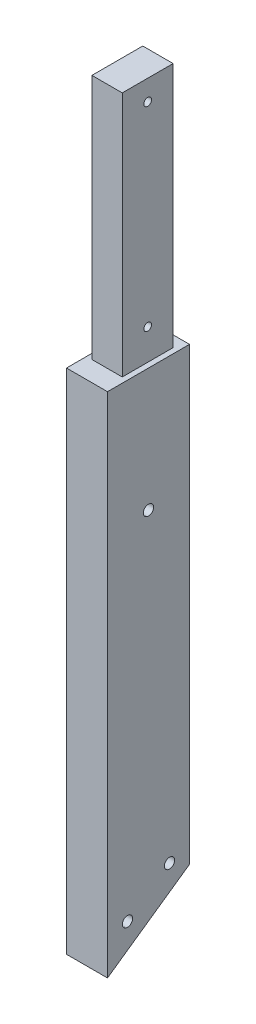
ISO-10303-21;
HEADER;
FILE_DESCRIPTION(('STEP AP214'),'2;1');
FILE_NAME('part.step','',(''),(''),'','','');
FILE_SCHEMA(('AUTOMOTIVE_DESIGN { 1 0 10303 214 1 1 1 1 }'));
ENDSEC;
DATA;
#1=APPLICATION_CONTEXT('core data for automotive mechanical design processes');
#2=APPLICATION_PROTOCOL_DEFINITION('international standard','automotive_design',2000,#1);
#3=PRODUCT_CONTEXT('',#1,'mechanical');
#4=PRODUCT('Part','Part','',(#3));
#5=PRODUCT_RELATED_PRODUCT_CATEGORY('part','',(#4));
#6=PRODUCT_DEFINITION_FORMATION('','',#4);
#7=PRODUCT_DEFINITION_CONTEXT('part definition',#1,'design');
#8=PRODUCT_DEFINITION('design','',#6,#7);
#9=PRODUCT_DEFINITION_SHAPE('','',#8);
#10=(LENGTH_UNIT() NAMED_UNIT(*) SI_UNIT(.MILLI.,.METRE.));
#11=(NAMED_UNIT(*) PLANE_ANGLE_UNIT() SI_UNIT($,.RADIAN.));
#12=(NAMED_UNIT(*) SI_UNIT($,.STERADIAN.) SOLID_ANGLE_UNIT());
#13=UNCERTAINTY_MEASURE_WITH_UNIT(LENGTH_MEASURE(1.E-05),#10,'distance_accuracy_value','');
#14=(GEOMETRIC_REPRESENTATION_CONTEXT(3) GLOBAL_UNCERTAINTY_ASSIGNED_CONTEXT((#13)) GLOBAL_UNIT_ASSIGNED_CONTEXT((#10,
#11,#12)) REPRESENTATION_CONTEXT('',''));
#15=CARTESIAN_POINT('',(0.,0.,0.));
#16=DIRECTION('',(0.,0.,1.));
#17=DIRECTION('',(1.,0.,0.));
#18=AXIS2_PLACEMENT_3D('',#15,#16,#17);
#19=CARTESIAN_POINT('',(0.,176.306244864133,-2.79400000000001));
#20=DIRECTION('',(1.,0.,0.));
#21=DIRECTION('',(0.,1.,0.));
#22=AXIS2_PLACEMENT_3D('',#19,#20,#21);
#23=CYLINDRICAL_SURFACE('',#22,2.38125);
#24=CARTESIAN_POINT('',(3.302,176.306244864133,-2.79400000000001));
#25=DIRECTION('',(1.,0.,0.));
#26=DIRECTION('',(0.,0.,-1.));
#27=AXIS2_PLACEMENT_3D('',#24,#25,#26);
#28=CIRCLE('',#27,2.38125);
#29=CARTESIAN_POINT('',(3.302,178.687494864133,-2.79400000000001));
#30=VERTEX_POINT('',#29);
#31=EDGE_CURVE('E136',#30,#30,#28,.F.);
#32=CARTESIAN_POINT('',(22.098,176.306244864133,-2.79400000000001));
#33=DIRECTION('',(-1.,0.,0.));
#34=DIRECTION('',(0.,0.,1.));
#35=AXIS2_PLACEMENT_3D('',#32,#33,#34);
#36=CIRCLE('',#35,2.38125);
#37=CARTESIAN_POINT('',(22.098,178.687494864133,-2.79400000000001));
#38=VERTEX_POINT('',#37);
#39=EDGE_CURVE('E107',#38,#38,#36,.F.);
#40=CARTESIAN_POINT('',(3.302,178.687494864133,-2.79400000000001));
#41=CARTESIAN_POINT('',(3.49779166666667,178.687494864133,-2.79400000000001));
#42=CARTESIAN_POINT('',(3.69358333333333,178.687494864133,-2.79400000000001));
#43=CARTESIAN_POINT('',(4.08516666666667,178.687494864133,-2.79400000000001));
#44=CARTESIAN_POINT('',(4.28095833333333,178.687494864133,-2.79400000000001));
#45=CARTESIAN_POINT('',(4.67254166666667,178.687494864133,-2.79400000000001));
#46=CARTESIAN_POINT('',(4.86833333333333,178.687494864133,-2.79400000000001));
#47=CARTESIAN_POINT('',(5.25991666666667,178.687494864133,-2.79400000000001));
#48=CARTESIAN_POINT('',(5.45570833333333,178.687494864133,-2.79400000000001));
#49=CARTESIAN_POINT('',(5.84729166666667,178.687494864133,-2.79400000000001));
#50=CARTESIAN_POINT('',(6.04308333333333,178.687494864133,-2.79400000000001));
#51=CARTESIAN_POINT('',(6.43466666666667,178.687494864133,-2.79400000000001));
#52=CARTESIAN_POINT('',(6.63045833333333,178.687494864133,-2.79400000000001));
#53=CARTESIAN_POINT('',(7.02204166666667,178.687494864133,-2.79400000000001));
#54=CARTESIAN_POINT('',(7.21783333333333,178.687494864133,-2.79400000000001));
#55=CARTESIAN_POINT('',(7.60941666666667,178.687494864133,-2.79400000000001));
#56=CARTESIAN_POINT('',(7.80520833333333,178.687494864133,-2.79400000000001));
#57=CARTESIAN_POINT('',(8.19679166666667,178.687494864133,-2.79400000000001));
#58=CARTESIAN_POINT('',(8.39258333333333,178.687494864133,-2.79400000000001));
#59=CARTESIAN_POINT('',(8.78416666666667,178.687494864133,-2.79400000000001));
#60=CARTESIAN_POINT('',(8.97995833333333,178.687494864133,-2.79400000000001));
#61=CARTESIAN_POINT('',(9.37154166666667,178.687494864133,-2.79400000000001));
#62=CARTESIAN_POINT('',(9.56733333333333,178.687494864133,-2.79400000000001));
#63=CARTESIAN_POINT('',(9.95891666666667,178.687494864133,-2.79400000000001));
#64=CARTESIAN_POINT('',(10.1547083333333,178.687494864133,-2.79400000000001));
#65=CARTESIAN_POINT('',(10.5462916666667,178.687494864133,-2.79400000000001));
#66=CARTESIAN_POINT('',(10.7420833333333,178.687494864133,-2.79400000000001));
#67=CARTESIAN_POINT('',(11.1336666666667,178.687494864133,-2.79400000000001));
#68=CARTESIAN_POINT('',(11.3294583333333,178.687494864133,-2.79400000000001));
#69=CARTESIAN_POINT('',(11.7210416666667,178.687494864133,-2.79400000000001));
#70=CARTESIAN_POINT('',(11.9168333333333,178.687494864133,-2.79400000000001));
#71=CARTESIAN_POINT('',(12.3084166666667,178.687494864133,-2.79400000000001));
#72=CARTESIAN_POINT('',(12.5042083333333,178.687494864133,-2.79400000000001));
#73=CARTESIAN_POINT('',(12.8957916666667,178.687494864133,-2.79400000000001));
#74=CARTESIAN_POINT('',(13.0915833333333,178.687494864133,-2.79400000000001));
#75=CARTESIAN_POINT('',(13.4831666666667,178.687494864133,-2.79400000000001));
#76=CARTESIAN_POINT('',(13.6789583333333,178.687494864133,-2.79400000000001));
#77=CARTESIAN_POINT('',(14.0705416666667,178.687494864133,-2.79400000000001));
#78=CARTESIAN_POINT('',(14.2663333333333,178.687494864133,-2.79400000000001));
#79=CARTESIAN_POINT('',(14.6579166666667,178.687494864133,-2.79400000000001));
#80=CARTESIAN_POINT('',(14.8537083333333,178.687494864133,-2.79400000000001));
#81=CARTESIAN_POINT('',(15.2452916666667,178.687494864133,-2.79400000000001));
#82=CARTESIAN_POINT('',(15.4410833333333,178.687494864133,-2.79400000000001));
#83=CARTESIAN_POINT('',(15.8326666666667,178.687494864133,-2.79400000000001));
#84=CARTESIAN_POINT('',(16.0284583333333,178.687494864133,-2.79400000000001));
#85=CARTESIAN_POINT('',(16.4200416666667,178.687494864133,-2.79400000000001));
#86=CARTESIAN_POINT('',(16.6158333333333,178.687494864133,-2.79400000000001));
#87=CARTESIAN_POINT('',(17.0074166666667,178.687494864133,-2.79400000000001));
#88=CARTESIAN_POINT('',(17.2032083333333,178.687494864133,-2.79400000000001));
#89=CARTESIAN_POINT('',(17.5947916666667,178.687494864133,-2.79400000000001));
#90=CARTESIAN_POINT('',(17.7905833333333,178.687494864133,-2.79400000000001));
#91=CARTESIAN_POINT('',(18.1821666666667,178.687494864133,-2.79400000000001));
#92=CARTESIAN_POINT('',(18.3779583333333,178.687494864133,-2.79400000000001));
#93=CARTESIAN_POINT('',(18.7695416666667,178.687494864133,-2.79400000000001));
#94=CARTESIAN_POINT('',(18.9653333333333,178.687494864133,-2.79400000000001));
#95=CARTESIAN_POINT('',(19.3569166666667,178.687494864133,-2.79400000000001));
#96=CARTESIAN_POINT('',(19.5527083333333,178.687494864133,-2.79400000000001));
#97=CARTESIAN_POINT('',(19.9442916666667,178.687494864133,-2.79400000000001));
#98=CARTESIAN_POINT('',(20.1400833333333,178.687494864133,-2.79400000000001));
#99=CARTESIAN_POINT('',(20.5316666666667,178.687494864133,-2.79400000000001));
#100=CARTESIAN_POINT('',(20.7274583333333,178.687494864133,-2.79400000000001));
#101=CARTESIAN_POINT('',(21.1190416666667,178.687494864133,-2.79400000000001));
#102=CARTESIAN_POINT('',(21.3148333333333,178.687494864133,-2.79400000000001));
#103=CARTESIAN_POINT('',(21.7064166666667,178.687494864133,-2.79400000000001));
#104=CARTESIAN_POINT('',(21.9022083333333,178.687494864133,-2.79400000000001));
#105=CARTESIAN_POINT('',(22.098,178.687494864133,-2.79400000000001));
#106=B_SPLINE_CURVE_WITH_KNOTS('',3,(#40,#41,#42,#43,#44,#45,#46,#47,#48,#49,#50,#51,#52,#53,
#54,#55,#56,#57,#58,#59,#60,#61,#62,#63,#64,#65,#66,#67,#68,#69,#70,#71,#72,#73,#74,#75,#76,#77,
#78,#79,#80,#81,#82,#83,#84,#85,#86,#87,#88,#89,#90,#91,#92,#93,#94,#95,#96,#97,#98,#99,#100,
#101,#102,#103,#104,#105),.UNSPECIFIED.,.F.,.F.,(4,2,2,2,2,2,2,2,2,2,2,2,2,2,2,2,2,2,2,2,2,2,2,
2,2,2,2,2,2,2,2,2,4),(0.,0.587375,1.17475,1.762125,2.3495,2.936875,3.52425,4.111625,4.699,
5.286375,5.87375,6.461125,7.0485,7.635875,8.22325,8.810625,9.398,9.985375,10.57275,11.160125,
11.7475,12.334875,12.92225,13.509625,14.097,14.684375,15.27175,15.859125,16.4465,17.033875,
17.62125,18.208625,18.796),.UNSPECIFIED.);
#107=EDGE_CURVE('BSEAM32',#30,#38,#106,.T.);
#108=ORIENTED_EDGE('',*,*,#31,.T.);
#109=ORIENTED_EDGE('',*,*,#39,.T.);
#110=ORIENTED_EDGE('',*,*,#107,.T.);
#111=ORIENTED_EDGE('',*,*,#107,.F.);
#112=EDGE_LOOP('',(#108,#110,#109,#111));
#113=FACE_BOUND('',#112,.T.);
#114=ADVANCED_FACE('F32',(#113),#23,.F.);
#115=CARTESIAN_POINT('',(3.302,309.644961162,0.));
#116=DIRECTION('',(1.,0.,0.));
#117=DIRECTION('',(0.,0.,-1.));
#118=AXIS2_PLACEMENT_3D('',#115,#116,#117);
#119=PLANE('',#118);
#120=DIRECTION('',(0.,0.,-1.));
#121=VECTOR('',#120,1.);
#122=CARTESIAN_POINT('',(3.302,309.644949162,0.));
#123=LINE('',#122,#121);
#124=CARTESIAN_POINT('',(3.302,309.644949162,12.954));
#125=VERTEX_POINT('',#124);
#126=CARTESIAN_POINT('',(3.302,309.644949162,-18.542));
#127=VERTEX_POINT('',#126);
#128=EDGE_CURVE('E140',#125,#127,#123,.T.);
#129=ORIENTED_EDGE('',*,*,#128,.T.);
#130=DIRECTION('',(0.,-1.,0.));
#131=VECTOR('',#130,1.);
#132=CARTESIAN_POINT('',(3.302,309.644961162,-18.542));
#133=LINE('',#132,#131);
#134=CARTESIAN_POINT('',(3.302,157.244949162,-18.542));
#135=VERTEX_POINT('',#134);
#136=EDGE_CURVE('E108',#127,#135,#133,.T.);
#137=ORIENTED_EDGE('',*,*,#136,.T.);
#138=DIRECTION('',(0.,0.,1.));
#139=VECTOR('',#138,1.);
#140=CARTESIAN_POINT('',(3.302,157.244949162,0.));
#141=LINE('',#140,#139);
#142=CARTESIAN_POINT('',(3.302,157.244949162,12.954));
#143=VERTEX_POINT('',#142);
#144=EDGE_CURVE('E111',#135,#143,#141,.T.);
#145=ORIENTED_EDGE('',*,*,#144,.T.);
#146=DIRECTION('',(0.,-1.,0.));
#147=VECTOR('',#146,1.);
#148=CARTESIAN_POINT('',(3.302,309.644961162,12.954));
#149=LINE('',#148,#147);
#150=EDGE_CURVE('E98',#125,#143,#149,.T.);
#151=ORIENTED_EDGE('',*,*,#150,.F.);
#152=EDGE_LOOP('',(#129,#137,#145,#151));
#153=FACE_BOUND('',#152,.T.);
#154=ORIENTED_EDGE('',*,*,#31,.F.);
#155=EDGE_LOOP('',(#154));
#156=FACE_BOUND('',#155,.T.);
#157=CARTESIAN_POINT('',(3.302,296.956244864133,-2.794));
#158=DIRECTION('',(1.,0.,0.));
#159=DIRECTION('',(0.,0.,-1.));
#160=AXIS2_PLACEMENT_3D('',#157,#158,#159);
#161=CIRCLE('',#160,2.38125000000001);
#162=CARTESIAN_POINT('',(3.302,299.337494864133,-2.794));
#163=VERTEX_POINT('',#162);
#164=EDGE_CURVE('E137',#163,#163,#161,.F.);
#165=ORIENTED_EDGE('',*,*,#164,.F.);
#166=EDGE_LOOP('',(#165));
#167=FACE_BOUND('',#166,.T.);
#168=ADVANCED_FACE('F112',(#153,#156,#167),#119,.F.);
#169=CARTESIAN_POINT('',(22.098,309.644961162,0.));
#170=DIRECTION('',(-1.,0.,0.));
#171=DIRECTION('',(0.,0.,1.));
#172=AXIS2_PLACEMENT_3D('',#169,#170,#171);
#173=PLANE('',#172);
#174=DIRECTION('',(0.,0.,1.));
#175=VECTOR('',#174,1.);
#176=CARTESIAN_POINT('',(22.098,309.644949162,0.));
#177=LINE('',#176,#175);
#178=CARTESIAN_POINT('',(22.098,309.644949162,-18.542));
#179=VERTEX_POINT('',#178);
#180=CARTESIAN_POINT('',(22.098,309.644949162,12.954));
#181=VERTEX_POINT('',#180);
#182=EDGE_CURVE('E134',#179,#181,#177,.T.);
#183=ORIENTED_EDGE('',*,*,#182,.T.);
#184=DIRECTION('',(0.,-1.,0.));
#185=VECTOR('',#184,1.);
#186=CARTESIAN_POINT('',(22.098,309.644961162,12.954));
#187=LINE('',#186,#185);
#188=CARTESIAN_POINT('',(22.098,157.244949162,12.954));
#189=VERTEX_POINT('',#188);
#190=EDGE_CURVE('E127',#181,#189,#187,.T.);
#191=ORIENTED_EDGE('',*,*,#190,.T.);
#192=DIRECTION('',(0.,0.,-1.));
#193=VECTOR('',#192,1.);
#194=CARTESIAN_POINT('',(22.098,157.244949162,0.));
#195=LINE('',#194,#193);
#196=CARTESIAN_POINT('',(22.098,157.244949162,-18.542));
#197=VERTEX_POINT('',#196);
#198=EDGE_CURVE('E122',#189,#197,#195,.T.);
#199=ORIENTED_EDGE('',*,*,#198,.T.);
#200=DIRECTION('',(0.,-1.,0.));
#201=VECTOR('',#200,1.);
#202=CARTESIAN_POINT('',(22.098,309.644961162,-18.542));
#203=LINE('',#202,#201);
#204=EDGE_CURVE('E47',#179,#197,#203,.T.);
#205=ORIENTED_EDGE('',*,*,#204,.F.);
#206=EDGE_LOOP('',(#183,#191,#199,#205));
#207=FACE_BOUND('',#206,.T.);
#208=ORIENTED_EDGE('',*,*,#39,.F.);
#209=EDGE_LOOP('',(#208));
#210=FACE_BOUND('',#209,.T.);
#211=CARTESIAN_POINT('',(22.098,296.956244864133,-2.794));
#212=DIRECTION('',(-1.,0.,0.));
#213=DIRECTION('',(0.,0.,1.));
#214=AXIS2_PLACEMENT_3D('',#211,#212,#213);
#215=CIRCLE('',#214,2.38125000000001);
#216=CARTESIAN_POINT('',(22.098,299.337494864133,-2.794));
#217=VERTEX_POINT('',#216);
#218=EDGE_CURVE('E131',#217,#217,#215,.F.);
#219=ORIENTED_EDGE('',*,*,#218,.F.);
#220=EDGE_LOOP('',(#219));
#221=FACE_BOUND('',#220,.T.);
#222=ADVANCED_FACE('F197',(#207,#210,#221),#173,.F.);
#223=CARTESIAN_POINT('',(0.,309.644961162,12.954));
#224=DIRECTION('',(0.,0.,-1.));
#225=DIRECTION('',(-1.,0.,0.));
#226=AXIS2_PLACEMENT_3D('',#223,#224,#225);
#227=PLANE('',#226);
#228=DIRECTION('',(-1.,0.,0.));
#229=VECTOR('',#228,1.);
#230=CARTESIAN_POINT('',(0.,309.644949162,12.954));
#231=LINE('',#230,#229);
#232=EDGE_CURVE('E11',#181,#125,#231,.T.);
#233=ORIENTED_EDGE('',*,*,#232,.T.);
#234=ORIENTED_EDGE('',*,*,#150,.T.);
#235=DIRECTION('',(1.,0.,0.));
#236=VECTOR('',#235,1.);
#237=CARTESIAN_POINT('',(0.,157.244949162,12.954));
#238=LINE('',#237,#236);
#239=EDGE_CURVE('E103',#143,#189,#238,.T.);
#240=ORIENTED_EDGE('',*,*,#239,.T.);
#241=ORIENTED_EDGE('',*,*,#190,.F.);
#242=EDGE_LOOP('',(#233,#234,#240,#241));
#243=FACE_BOUND('',#242,.T.);
#244=ADVANCED_FACE('F100',(#243),#227,.F.);
#245=CARTESIAN_POINT('',(0.,309.644961162,-18.542));
#246=DIRECTION('',(0.,0.,1.));
#247=DIRECTION('',(1.,0.,0.));
#248=AXIS2_PLACEMENT_3D('',#245,#246,#247);
#249=PLANE('',#248);
#250=DIRECTION('',(1.,0.,0.));
#251=VECTOR('',#250,1.);
#252=CARTESIAN_POINT('',(0.,309.644949162,-18.542));
#253=LINE('',#252,#251);
#254=EDGE_CURVE('E40',#127,#179,#253,.T.);
#255=ORIENTED_EDGE('',*,*,#254,.T.);
#256=ORIENTED_EDGE('',*,*,#204,.T.);
#257=DIRECTION('',(-1.,0.,0.));
#258=VECTOR('',#257,1.);
#259=CARTESIAN_POINT('',(0.,157.244949162,-18.542));
#260=LINE('',#259,#258);
#261=EDGE_CURVE('E118',#197,#135,#260,.T.);
#262=ORIENTED_EDGE('',*,*,#261,.T.);
#263=ORIENTED_EDGE('',*,*,#136,.F.);
#264=EDGE_LOOP('',(#255,#256,#262,#263));
#265=FACE_BOUND('',#264,.T.);
#266=ADVANCED_FACE('F194',(#265),#249,.F.);
#267=CARTESIAN_POINT('',(0.,296.956244864133,-2.794));
#268=DIRECTION('',(1.,0.,0.));
#269=DIRECTION('',(0.,1.,0.));
#270=AXIS2_PLACEMENT_3D('',#267,#268,#269);
#271=CYLINDRICAL_SURFACE('',#270,2.38125000000001);
#272=CARTESIAN_POINT('',(3.302,299.337494864133,-2.794));
#273=CARTESIAN_POINT('',(3.49779166666667,299.337494864133,-2.794));
#274=CARTESIAN_POINT('',(3.69358333333333,299.337494864133,-2.794));
#275=CARTESIAN_POINT('',(4.08516666666667,299.337494864133,-2.794));
#276=CARTESIAN_POINT('',(4.28095833333333,299.337494864133,-2.794));
#277=CARTESIAN_POINT('',(4.67254166666667,299.337494864133,-2.794));
#278=CARTESIAN_POINT('',(4.86833333333333,299.337494864133,-2.794));
#279=CARTESIAN_POINT('',(5.25991666666667,299.337494864133,-2.794));
#280=CARTESIAN_POINT('',(5.45570833333333,299.337494864133,-2.794));
#281=CARTESIAN_POINT('',(5.84729166666667,299.337494864133,-2.794));
#282=CARTESIAN_POINT('',(6.04308333333333,299.337494864133,-2.794));
#283=CARTESIAN_POINT('',(6.43466666666667,299.337494864133,-2.794));
#284=CARTESIAN_POINT('',(6.63045833333333,299.337494864133,-2.794));
#285=CARTESIAN_POINT('',(7.02204166666667,299.337494864133,-2.794));
#286=CARTESIAN_POINT('',(7.21783333333333,299.337494864133,-2.794));
#287=CARTESIAN_POINT('',(7.60941666666667,299.337494864133,-2.794));
#288=CARTESIAN_POINT('',(7.80520833333333,299.337494864133,-2.794));
#289=CARTESIAN_POINT('',(8.19679166666667,299.337494864133,-2.794));
#290=CARTESIAN_POINT('',(8.39258333333333,299.337494864133,-2.794));
#291=CARTESIAN_POINT('',(8.78416666666667,299.337494864133,-2.794));
#292=CARTESIAN_POINT('',(8.97995833333334,299.337494864133,-2.794));
#293=CARTESIAN_POINT('',(9.37154166666667,299.337494864133,-2.794));
#294=CARTESIAN_POINT('',(9.56733333333334,299.337494864133,-2.794));
#295=CARTESIAN_POINT('',(9.95891666666667,299.337494864133,-2.794));
#296=CARTESIAN_POINT('',(10.1547083333333,299.337494864133,-2.794));
#297=CARTESIAN_POINT('',(10.5462916666667,299.337494864133,-2.794));
#298=CARTESIAN_POINT('',(10.7420833333333,299.337494864133,-2.794));
#299=CARTESIAN_POINT('',(11.1336666666667,299.337494864133,-2.794));
#300=CARTESIAN_POINT('',(11.3294583333333,299.337494864133,-2.794));
#301=CARTESIAN_POINT('',(11.7210416666667,299.337494864133,-2.794));
#302=CARTESIAN_POINT('',(11.9168333333333,299.337494864133,-2.794));
#303=CARTESIAN_POINT('',(12.3084166666667,299.337494864133,-2.794));
#304=CARTESIAN_POINT('',(12.5042083333333,299.337494864133,-2.794));
#305=CARTESIAN_POINT('',(12.8957916666667,299.337494864133,-2.794));
#306=CARTESIAN_POINT('',(13.0915833333333,299.337494864133,-2.794));
#307=CARTESIAN_POINT('',(13.4831666666667,299.337494864133,-2.794));
#308=CARTESIAN_POINT('',(13.6789583333333,299.337494864133,-2.794));
#309=CARTESIAN_POINT('',(14.0705416666667,299.337494864133,-2.794));
#310=CARTESIAN_POINT('',(14.2663333333333,299.337494864133,-2.794));
#311=CARTESIAN_POINT('',(14.6579166666667,299.337494864133,-2.794));
#312=CARTESIAN_POINT('',(14.8537083333333,299.337494864133,-2.794));
#313=CARTESIAN_POINT('',(15.2452916666667,299.337494864133,-2.794));
#314=CARTESIAN_POINT('',(15.4410833333333,299.337494864133,-2.794));
#315=CARTESIAN_POINT('',(15.8326666666667,299.337494864133,-2.794));
#316=CARTESIAN_POINT('',(16.0284583333333,299.337494864133,-2.794));
#317=CARTESIAN_POINT('',(16.4200416666667,299.337494864133,-2.794));
#318=CARTESIAN_POINT('',(16.6158333333333,299.337494864133,-2.794));
#319=CARTESIAN_POINT('',(17.0074166666667,299.337494864133,-2.794));
#320=CARTESIAN_POINT('',(17.2032083333333,299.337494864133,-2.794));
#321=CARTESIAN_POINT('',(17.5947916666667,299.337494864133,-2.794));
#322=CARTESIAN_POINT('',(17.7905833333333,299.337494864133,-2.794));
#323=CARTESIAN_POINT('',(18.1821666666667,299.337494864133,-2.794));
#324=CARTESIAN_POINT('',(18.3779583333333,299.337494864133,-2.794));
#325=CARTESIAN_POINT('',(18.7695416666667,299.337494864133,-2.794));
#326=CARTESIAN_POINT('',(18.9653333333333,299.337494864133,-2.794));
#327=CARTESIAN_POINT('',(19.3569166666667,299.337494864133,-2.794));
#328=CARTESIAN_POINT('',(19.5527083333333,299.337494864133,-2.794));
#329=CARTESIAN_POINT('',(19.9442916666667,299.337494864133,-2.794));
#330=CARTESIAN_POINT('',(20.1400833333333,299.337494864133,-2.794));
#331=CARTESIAN_POINT('',(20.5316666666667,299.337494864133,-2.794));
#332=CARTESIAN_POINT('',(20.7274583333333,299.337494864133,-2.794));
#333=CARTESIAN_POINT('',(21.1190416666667,299.337494864133,-2.794));
#334=CARTESIAN_POINT('',(21.3148333333333,299.337494864133,-2.794));
#335=CARTESIAN_POINT('',(21.7064166666667,299.337494864133,-2.794));
#336=CARTESIAN_POINT('',(21.9022083333333,299.337494864133,-2.794));
#337=CARTESIAN_POINT('',(22.098,299.337494864133,-2.794));
#338=B_SPLINE_CURVE_WITH_KNOTS('',3,(#272,#273,#274,#275,#276,#277,#278,#279,#280,#281,#282,
#283,#284,#285,#286,#287,#288,#289,#290,#291,#292,#293,#294,#295,#296,#297,#298,#299,#300,#301,
#302,#303,#304,#305,#306,#307,#308,#309,#310,#311,#312,#313,#314,#315,#316,#317,#318,#319,#320,
#321,#322,#323,#324,#325,#326,#327,#328,#329,#330,#331,#332,#333,#334,#335,#336,#337),
.UNSPECIFIED.,.F.,.F.,(4,2,2,2,2,2,2,2,2,2,2,2,2,2,2,2,2,2,2,2,2,2,2,2,2,2,2,2,2,2,2,2,4),(0.,
0.587375,1.17475,1.762125,2.3495,2.936875,3.52425,4.111625,4.699,5.286375,5.87375,6.461125,
7.0485,7.635875,8.22325000000001,8.810625,9.39800000000001,9.98537500000001,10.57275,11.160125,
11.7475,12.334875,12.92225,13.509625,14.097,14.684375,15.27175,15.859125,16.4465,17.033875,
17.62125,18.208625,18.796),.UNSPECIFIED.);
#339=EDGE_CURVE('BSEAM205',#163,#217,#338,.T.);
#340=ORIENTED_EDGE('',*,*,#164,.T.);
#341=ORIENTED_EDGE('',*,*,#218,.T.);
#342=ORIENTED_EDGE('',*,*,#339,.T.);
#343=ORIENTED_EDGE('',*,*,#339,.F.);
#344=EDGE_LOOP('',(#340,#342,#341,#343));
#345=FACE_BOUND('',#344,.T.);
#346=ADVANCED_FACE('F205',(#345),#271,.F.);
#347=CARTESIAN_POINT('',(0.,-157.244949162,25.4));
#348=DIRECTION('',(0.,0.819152044288991,0.573576436351047));
#349=DIRECTION('',(0.,-0.573576436351047,0.819152044288991));
#350=AXIS2_PLACEMENT_3D('',#347,#348,#349);
#351=PLANE('',#350);
#352=DIRECTION('',(0.,-0.573576436351047,0.819152044288991));
#353=VECTOR('',#352,1.);
#354=CARTESIAN_POINT('',(25.4,-157.244949162,25.4));
#355=LINE('',#354,#353);
#356=CARTESIAN_POINT('',(25.4,-121.674406220947,-25.4));
#357=VERTEX_POINT('',#356);
#358=CARTESIAN_POINT('',(25.4,-157.244949162,25.4));
#359=VERTEX_POINT('',#358);
#360=EDGE_CURVE('E167',#357,#359,#355,.T.);
#361=ORIENTED_EDGE('',*,*,#360,.T.);
#362=DIRECTION('',(-1.,0.,0.));
#363=VECTOR('',#362,1.);
#364=CARTESIAN_POINT('',(25.4,-157.244949162,25.4));
#365=LINE('',#364,#363);
#366=CARTESIAN_POINT('',(0.,-157.244949162,25.4));
#367=VERTEX_POINT('',#366);
#368=EDGE_CURVE('E183',#359,#367,#365,.T.);
#369=ORIENTED_EDGE('',*,*,#368,.T.);
#370=DIRECTION('',(0.,-0.573576436351047,0.819152044288991));
#371=VECTOR('',#370,1.);
#372=CARTESIAN_POINT('',(0.,-157.244949162,25.4));
#373=LINE('',#372,#371);
#374=CARTESIAN_POINT('',(0.,-121.674406220947,-25.4));
#375=VERTEX_POINT('',#374);
#376=EDGE_CURVE('E170',#375,#367,#373,.T.);
#377=ORIENTED_EDGE('',*,*,#376,.F.);
#378=DIRECTION('',(1.,0.,0.));
#379=VECTOR('',#378,1.);
#380=CARTESIAN_POINT('',(0.,-121.674406220947,-25.4));
#381=LINE('',#380,#379);
#382=EDGE_CURVE('E173',#375,#357,#381,.T.);
#383=ORIENTED_EDGE('',*,*,#382,.T.);
#384=EDGE_LOOP('',(#361,#369,#377,#383));
#385=FACE_BOUND('',#384,.T.);
#386=ADVANCED_FACE('F207',(#385),#351,.F.);
#387=CARTESIAN_POINT('',(0.,-133.061366341276,13.0040387030877));
#388=DIRECTION('',(1.,0.,0.));
#389=DIRECTION('',(0.,0.,-1.));
#390=AXIS2_PLACEMENT_3D('',#387,#388,#389);
#391=CYLINDRICAL_SURFACE('',#390,3.17499999999998);
#392=CARTESIAN_POINT('',(0.,-133.061366341276,13.0040387030877));
#393=DIRECTION('',(1.,0.,0.));
#394=DIRECTION('',(0.,0.,-1.));
#395=AXIS2_PLACEMENT_3D('',#392,#393,#394);
#396=CIRCLE('',#395,3.17499999999998);
#397=CARTESIAN_POINT('',(0.,-133.061366341276,9.82903870308774));
#398=VERTEX_POINT('',#397);
#399=EDGE_CURVE('E164',#398,#398,#396,.T.);
#400=ORIENTED_EDGE('',*,*,#399,.F.);
#401=EDGE_LOOP('',(#400));
#402=FACE_BOUND('',#401,.T.);
#403=CARTESIAN_POINT('',(25.4,-133.061366341276,13.0040387030877));
#404=DIRECTION('',(1.,0.,0.));
#405=DIRECTION('',(0.,0.,-1.));
#406=AXIS2_PLACEMENT_3D('',#403,#404,#405);
#407=CIRCLE('',#406,3.17499999999998);
#408=CARTESIAN_POINT('',(25.4,-133.061366341276,9.82903870308774));
#409=VERTEX_POINT('',#408);
#410=EDGE_CURVE('E161',#409,#409,#407,.T.);
#411=ORIENTED_EDGE('',*,*,#410,.T.);
#412=EDGE_LOOP('',(#411));
#413=FACE_BOUND('',#412,.T.);
#414=ADVANCED_FACE('F214',(#402,#413),#391,.F.);
#415=CARTESIAN_POINT('',(0.,-114.85031448713,-13.0040387030877));
#416=DIRECTION('',(1.,0.,0.));
#417=DIRECTION('',(0.,0.,-1.));
#418=AXIS2_PLACEMENT_3D('',#415,#416,#417);
#419=CYLINDRICAL_SURFACE('',#418,3.17499999999998);
#420=CARTESIAN_POINT('',(0.,-114.85031448713,-13.0040387030877));
#421=DIRECTION('',(1.,0.,0.));
#422=DIRECTION('',(0.,0.,-1.));
#423=AXIS2_PLACEMENT_3D('',#420,#421,#422);
#424=CIRCLE('',#423,3.17499999999998);
#425=CARTESIAN_POINT('',(0.,-114.85031448713,-16.1790387030877));
#426=VERTEX_POINT('',#425);
#427=EDGE_CURVE('E158',#426,#426,#424,.T.);
#428=ORIENTED_EDGE('',*,*,#427,.F.);
#429=EDGE_LOOP('',(#428));
#430=FACE_BOUND('',#429,.T.);
#431=CARTESIAN_POINT('',(25.4,-114.85031448713,-13.0040387030877));
#432=DIRECTION('',(1.,0.,0.));
#433=DIRECTION('',(0.,0.,-1.));
#434=AXIS2_PLACEMENT_3D('',#431,#432,#433);
#435=CIRCLE('',#434,3.17499999999998);
#436=CARTESIAN_POINT('',(25.4,-114.85031448713,-16.1790387030877));
#437=VERTEX_POINT('',#436);
#438=EDGE_CURVE('E155',#437,#437,#435,.T.);
#439=ORIENTED_EDGE('',*,*,#438,.T.);
#440=EDGE_LOOP('',(#439));
#441=FACE_BOUND('',#440,.T.);
#442=ADVANCED_FACE('F317',(#430,#441),#419,.F.);
#443=CARTESIAN_POINT('',(0.,81.044949162,0.));
#444=DIRECTION('',(1.,0.,0.));
#445=DIRECTION('',(0.,0.,-1.));
#446=AXIS2_PLACEMENT_3D('',#443,#444,#445);
#447=CYLINDRICAL_SURFACE('',#446,3.175);
#448=CARTESIAN_POINT('',(0.,81.044949162,0.));
#449=DIRECTION('',(1.,0.,0.));
#450=DIRECTION('',(0.,0.,-1.));
#451=AXIS2_PLACEMENT_3D('',#448,#449,#450);
#452=CIRCLE('',#451,3.175);
#453=CARTESIAN_POINT('',(0.,81.044949162,-3.17500000000001));
#454=VERTEX_POINT('',#453);
#455=EDGE_CURVE('E152',#454,#454,#452,.T.);
#456=ORIENTED_EDGE('',*,*,#455,.F.);
#457=EDGE_LOOP('',(#456));
#458=FACE_BOUND('',#457,.T.);
#459=CARTESIAN_POINT('',(25.4,81.044949162,0.));
#460=DIRECTION('',(1.,0.,0.));
#461=DIRECTION('',(0.,0.,-1.));
#462=AXIS2_PLACEMENT_3D('',#459,#460,#461);
#463=CIRCLE('',#462,3.175);
#464=CARTESIAN_POINT('',(25.4,81.044949162,-3.17500000000001));
#465=VERTEX_POINT('',#464);
#466=EDGE_CURVE('E151',#465,#465,#463,.T.);
#467=ORIENTED_EDGE('',*,*,#466,.T.);
#468=EDGE_LOOP('',(#467));
#469=FACE_BOUND('',#468,.T.);
#470=ADVANCED_FACE('F254',(#458,#469),#447,.F.);
#471=CARTESIAN_POINT('',(0.,157.244949162,25.4));
#472=DIRECTION('',(0.,-1.,0.));
#473=DIRECTION('',(0.,0.,-1.));
#474=AXIS2_PLACEMENT_3D('',#471,#472,#473);
#475=PLANE('',#474);
#476=DIRECTION('',(0.,0.,-1.));
#477=VECTOR('',#476,1.);
#478=CARTESIAN_POINT('',(25.4,157.244949162,25.4));
#479=LINE('',#478,#477);
#480=CARTESIAN_POINT('',(25.4,157.244949162,25.4));
#481=VERTEX_POINT('',#480);
#482=CARTESIAN_POINT('',(25.4,157.244949162,-25.4));
#483=VERTEX_POINT('',#482);
#484=EDGE_CURVE('E145',#481,#483,#479,.T.);
#485=ORIENTED_EDGE('',*,*,#484,.T.);
#486=DIRECTION('',(-1.,0.,0.));
#487=VECTOR('',#486,1.);
#488=CARTESIAN_POINT('',(25.4,157.244949162,-25.4));
#489=LINE('',#488,#487);
#490=CARTESIAN_POINT('',(0.,157.244949162,-25.4));
#491=VERTEX_POINT('',#490);
#492=EDGE_CURVE('E142',#483,#491,#489,.T.);
#493=ORIENTED_EDGE('',*,*,#492,.T.);
#494=DIRECTION('',(0.,0.,-1.));
#495=VECTOR('',#494,1.);
#496=CARTESIAN_POINT('',(0.,157.244949162,25.4));
#497=LINE('',#496,#495);
#498=CARTESIAN_POINT('',(0.,157.244949162,25.4));
#499=VERTEX_POINT('',#498);
#500=EDGE_CURVE('E146',#499,#491,#497,.T.);
#501=ORIENTED_EDGE('',*,*,#500,.F.);
#502=DIRECTION('',(1.,0.,0.));
#503=VECTOR('',#502,1.);
#504=CARTESIAN_POINT('',(0.,157.244949162,25.4));
#505=LINE('',#504,#503);
#506=EDGE_CURVE('E148',#499,#481,#505,.T.);
#507=ORIENTED_EDGE('',*,*,#506,.T.);
#508=EDGE_LOOP('',(#485,#493,#501,#507));
#509=FACE_BOUND('',#508,.T.);
#510=ORIENTED_EDGE('',*,*,#239,.F.);
#511=ORIENTED_EDGE('',*,*,#144,.F.);
#512=ORIENTED_EDGE('',*,*,#261,.F.);
#513=ORIENTED_EDGE('',*,*,#198,.F.);
#514=EDGE_LOOP('',(#510,#511,#512,#513));
#515=FACE_BOUND('',#514,.T.);
#516=ADVANCED_FACE('F121',(#509,#515),#475,.F.);
#517=CARTESIAN_POINT('',(25.4,-157.244949162,25.4));
#518=DIRECTION('',(0.,0.,-1.));
#519=DIRECTION('',(-1.,0.,0.));
#520=AXIS2_PLACEMENT_3D('',#517,#518,#519);
#521=PLANE('',#520);
#522=DIRECTION('',(0.,-1.,0.));
#523=VECTOR('',#522,1.);
#524=CARTESIAN_POINT('',(25.4,-157.244949162,25.4));
#525=LINE('',#524,#523);
#526=EDGE_CURVE('E181',#481,#359,#525,.T.);
#527=ORIENTED_EDGE('',*,*,#526,.F.);
#528=ORIENTED_EDGE('',*,*,#506,.F.);
#529=DIRECTION('',(0.,-1.,0.));
#530=VECTOR('',#529,1.);
#531=CARTESIAN_POINT('',(0.,-157.244949162,25.4));
#532=LINE('',#531,#530);
#533=EDGE_CURVE('E55',#499,#367,#532,.T.);
#534=ORIENTED_EDGE('',*,*,#533,.T.);
#535=ORIENTED_EDGE('',*,*,#368,.F.);
#536=EDGE_LOOP('',(#527,#528,#534,#535));
#537=FACE_BOUND('',#536,.T.);
#538=ADVANCED_FACE('F253',(#537),#521,.F.);
#539=CARTESIAN_POINT('',(0.,0.,0.));
#540=DIRECTION('',(-1.,0.,0.));
#541=DIRECTION('',(0.,0.,1.));
#542=AXIS2_PLACEMENT_3D('',#539,#540,#541);
#543=PLANE('',#542);
#544=ORIENTED_EDGE('',*,*,#455,.T.);
#545=EDGE_LOOP('',(#544));
#546=FACE_BOUND('',#545,.T.);
#547=ORIENTED_EDGE('',*,*,#427,.T.);
#548=EDGE_LOOP('',(#547));
#549=FACE_BOUND('',#548,.T.);
#550=ORIENTED_EDGE('',*,*,#399,.T.);
#551=EDGE_LOOP('',(#550));
#552=FACE_BOUND('',#551,.T.);
#553=ORIENTED_EDGE('',*,*,#500,.T.);
#554=DIRECTION('',(0.,1.,0.));
#555=VECTOR('',#554,1.);
#556=CARTESIAN_POINT('',(0.,-157.244949162,-25.4));
#557=LINE('',#556,#555);
#558=EDGE_CURVE('E177',#375,#491,#557,.T.);
#559=ORIENTED_EDGE('',*,*,#558,.F.);
#560=ORIENTED_EDGE('',*,*,#376,.T.);
#561=ORIENTED_EDGE('',*,*,#533,.F.);
#562=EDGE_LOOP('',(#553,#559,#560,#561));
#563=FACE_BOUND('',#562,.T.);
#564=ADVANCED_FACE('F265',(#546,#549,#552,#563),#543,.T.);
#565=CARTESIAN_POINT('',(25.4,0.,0.));
#566=DIRECTION('',(-1.,0.,0.));
#567=DIRECTION('',(0.,0.,1.));
#568=AXIS2_PLACEMENT_3D('',#565,#566,#567);
#569=PLANE('',#568);
#570=ORIENTED_EDGE('',*,*,#410,.F.);
#571=EDGE_LOOP('',(#570));
#572=FACE_BOUND('',#571,.T.);
#573=ORIENTED_EDGE('',*,*,#438,.F.);
#574=EDGE_LOOP('',(#573));
#575=FACE_BOUND('',#574,.T.);
#576=ORIENTED_EDGE('',*,*,#466,.F.);
#577=EDGE_LOOP('',(#576));
#578=FACE_BOUND('',#577,.T.);
#579=DIRECTION('',(0.,1.,0.));
#580=VECTOR('',#579,1.);
#581=CARTESIAN_POINT('',(25.4,-157.244949162,-25.4));
#582=LINE('',#581,#580);
#583=EDGE_CURVE('E178',#357,#483,#582,.T.);
#584=ORIENTED_EDGE('',*,*,#583,.T.);
#585=ORIENTED_EDGE('',*,*,#484,.F.);
#586=ORIENTED_EDGE('',*,*,#526,.T.);
#587=ORIENTED_EDGE('',*,*,#360,.F.);
#588=EDGE_LOOP('',(#584,#585,#586,#587));
#589=FACE_BOUND('',#588,.T.);
#590=ADVANCED_FACE('F276',(#572,#575,#578,#589),#569,.F.);
#591=CARTESIAN_POINT('',(25.4,-157.244949162,-25.4));
#592=DIRECTION('',(0.,0.,1.));
#593=DIRECTION('',(1.,0.,0.));
#594=AXIS2_PLACEMENT_3D('',#591,#592,#593);
#595=PLANE('',#594);
#596=ORIENTED_EDGE('',*,*,#492,.F.);
#597=ORIENTED_EDGE('',*,*,#583,.F.);
#598=ORIENTED_EDGE('',*,*,#382,.F.);
#599=ORIENTED_EDGE('',*,*,#558,.T.);
#600=EDGE_LOOP('',(#596,#597,#598,#599));
#601=FACE_BOUND('',#600,.T.);
#602=ADVANCED_FACE('F34',(#601),#595,.F.);
#603=CARTESIAN_POINT('',(0.,309.644949162,0.));
#604=DIRECTION('',(0.,1.,0.));
#605=DIRECTION('',(0.,0.,1.));
#606=AXIS2_PLACEMENT_3D('',#603,#604,#605);
#607=PLANE('',#606);
#608=ORIENTED_EDGE('',*,*,#232,.F.);
#609=ORIENTED_EDGE('',*,*,#182,.F.);
#610=ORIENTED_EDGE('',*,*,#254,.F.);
#611=ORIENTED_EDGE('',*,*,#128,.F.);
#612=EDGE_LOOP('',(#608,#609,#610,#611));
#613=FACE_BOUND('',#612,.T.);
#614=ADVANCED_FACE('F196',(#613),#607,.T.);
#615=CLOSED_SHELL('',(#114,#168,#222,#244,#266,#346,#386,#414,#442,#470,#516,#538,#564,#590,
#602,#614));
#616=MANIFOLD_SOLID_BREP('B2',#615);
#617=ADVANCED_BREP_SHAPE_REPRESENTATION('',(#18,#616),#14);
#618=SHAPE_DEFINITION_REPRESENTATION(#9,#617);
ENDSEC;
END-ISO-10303-21;
